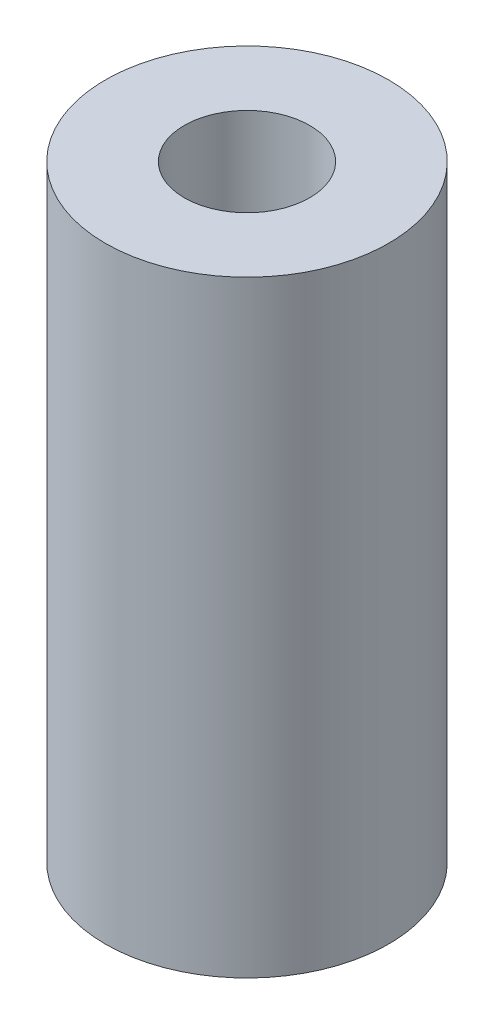
ISO-10303-21;
HEADER;
FILE_DESCRIPTION(('STEP AP214'),'2;1');
FILE_NAME('part.step','',(''),(''),'','','');
FILE_SCHEMA(('AUTOMOTIVE_DESIGN { 1 0 10303 214 1 1 1 1 }'));
ENDSEC;
DATA;
#1=APPLICATION_CONTEXT('core data for automotive mechanical design processes');
#2=APPLICATION_PROTOCOL_DEFINITION('international standard','automotive_design',2000,#1);
#3=PRODUCT_CONTEXT('',#1,'mechanical');
#4=PRODUCT('Part','Part','',(#3));
#5=PRODUCT_RELATED_PRODUCT_CATEGORY('part','',(#4));
#6=PRODUCT_DEFINITION_FORMATION('','',#4);
#7=PRODUCT_DEFINITION_CONTEXT('part definition',#1,'design');
#8=PRODUCT_DEFINITION('design','',#6,#7);
#9=PRODUCT_DEFINITION_SHAPE('','',#8);
#10=(LENGTH_UNIT() NAMED_UNIT(*) SI_UNIT(.MILLI.,.METRE.));
#11=(NAMED_UNIT(*) PLANE_ANGLE_UNIT() SI_UNIT($,.RADIAN.));
#12=(NAMED_UNIT(*) SI_UNIT($,.STERADIAN.) SOLID_ANGLE_UNIT());
#13=UNCERTAINTY_MEASURE_WITH_UNIT(LENGTH_MEASURE(1.E-05),#10,'distance_accuracy_value','');
#14=(GEOMETRIC_REPRESENTATION_CONTEXT(3) GLOBAL_UNCERTAINTY_ASSIGNED_CONTEXT((#13)) GLOBAL_UNIT_ASSIGNED_CONTEXT((#10,
#11,#12)) REPRESENTATION_CONTEXT('',''));
#15=CARTESIAN_POINT('',(0.,0.,0.));
#16=DIRECTION('',(0.,0.,1.));
#17=DIRECTION('',(1.,0.,0.));
#18=AXIS2_PLACEMENT_3D('',#15,#16,#17);
#19=CARTESIAN_POINT('',(0.,15.,0.));
#20=DIRECTION('',(0.,1.,0.));
#21=DIRECTION('',(0.,0.,1.));
#22=AXIS2_PLACEMENT_3D('',#19,#20,#21);
#23=PLANE('',#22);
#24=CARTESIAN_POINT('',(0.,15.,0.));
#25=DIRECTION('',(0.,1.,0.));
#26=DIRECTION('',(0.,0.,1.));
#27=AXIS2_PLACEMENT_3D('',#24,#25,#26);
#28=CIRCLE('',#27,3.5);
#29=CARTESIAN_POINT('',(0.,15.,3.5));
#30=VERTEX_POINT('',#29);
#31=EDGE_CURVE('E10',#30,#30,#28,.T.);
#32=ORIENTED_EDGE('',*,*,#31,.T.);
#33=EDGE_LOOP('',(#32));
#34=FACE_BOUND('',#33,.T.);
#35=CARTESIAN_POINT('',(0.,15.,0.));
#36=DIRECTION('',(0.,1.,0.));
#37=DIRECTION('',(0.,0.,1.));
#38=AXIS2_PLACEMENT_3D('',#35,#36,#37);
#39=CIRCLE('',#38,1.55);
#40=CARTESIAN_POINT('',(0.,15.,1.55));
#41=VERTEX_POINT('',#40);
#42=EDGE_CURVE('E43',#41,#41,#39,.T.);
#43=ORIENTED_EDGE('',*,*,#42,.F.);
#44=EDGE_LOOP('',(#43));
#45=FACE_BOUND('',#44,.T.);
#46=ADVANCED_FACE('F32',(#34,#45),#23,.T.);
#47=CARTESIAN_POINT('',(0.,0.,0.));
#48=DIRECTION('',(0.,1.,0.));
#49=DIRECTION('',(0.,0.,1.));
#50=AXIS2_PLACEMENT_3D('',#47,#48,#49);
#51=PLANE('',#50);
#52=CARTESIAN_POINT('',(0.,0.,0.));
#53=DIRECTION('',(0.,1.,0.));
#54=DIRECTION('',(0.,0.,1.));
#55=AXIS2_PLACEMENT_3D('',#52,#53,#54);
#56=CIRCLE('',#55,3.5);
#57=CARTESIAN_POINT('',(0.,0.,3.5));
#58=VERTEX_POINT('',#57);
#59=EDGE_CURVE('E36',#58,#58,#56,.T.);
#60=ORIENTED_EDGE('',*,*,#59,.F.);
#61=EDGE_LOOP('',(#60));
#62=FACE_BOUND('',#61,.T.);
#63=CARTESIAN_POINT('',(0.,0.,0.));
#64=DIRECTION('',(0.,1.,0.));
#65=DIRECTION('',(0.,0.,1.));
#66=AXIS2_PLACEMENT_3D('',#63,#64,#65);
#67=CIRCLE('',#66,1.55);
#68=CARTESIAN_POINT('',(0.,0.,1.55));
#69=VERTEX_POINT('',#68);
#70=EDGE_CURVE('E45',#69,#69,#67,.T.);
#71=ORIENTED_EDGE('',*,*,#70,.T.);
#72=EDGE_LOOP('',(#71));
#73=FACE_BOUND('',#72,.T.);
#74=ADVANCED_FACE('F55',(#62,#73),#51,.F.);
#75=CARTESIAN_POINT('',(0.,15.,0.));
#76=DIRECTION('',(0.,-1.,0.));
#77=DIRECTION('',(0.,0.,-1.));
#78=AXIS2_PLACEMENT_3D('',#75,#76,#77);
#79=CYLINDRICAL_SURFACE('',#78,3.5);
#80=ORIENTED_EDGE('',*,*,#31,.F.);
#81=EDGE_LOOP('',(#80));
#82=FACE_BOUND('',#81,.T.);
#83=ORIENTED_EDGE('',*,*,#59,.T.);
#84=EDGE_LOOP('',(#83));
#85=FACE_BOUND('',#84,.T.);
#86=ADVANCED_FACE('F34',(#82,#85),#79,.T.);
#87=CARTESIAN_POINT('',(0.,15.,0.));
#88=DIRECTION('',(0.,-1.,0.));
#89=DIRECTION('',(0.,0.,-1.));
#90=AXIS2_PLACEMENT_3D('',#87,#88,#89);
#91=CYLINDRICAL_SURFACE('',#90,1.55);
#92=ORIENTED_EDGE('',*,*,#42,.T.);
#93=EDGE_LOOP('',(#92));
#94=FACE_BOUND('',#93,.T.);
#95=ORIENTED_EDGE('',*,*,#70,.F.);
#96=EDGE_LOOP('',(#95));
#97=FACE_BOUND('',#96,.T.);
#98=ADVANCED_FACE('F51',(#94,#97),#91,.F.);
#99=CLOSED_SHELL('',(#46,#74,#86,#98));
#100=MANIFOLD_SOLID_BREP('B2',#99);
#101=ADVANCED_BREP_SHAPE_REPRESENTATION('',(#18,#100),#14);
#102=SHAPE_DEFINITION_REPRESENTATION(#9,#101);
ENDSEC;
END-ISO-10303-21;
